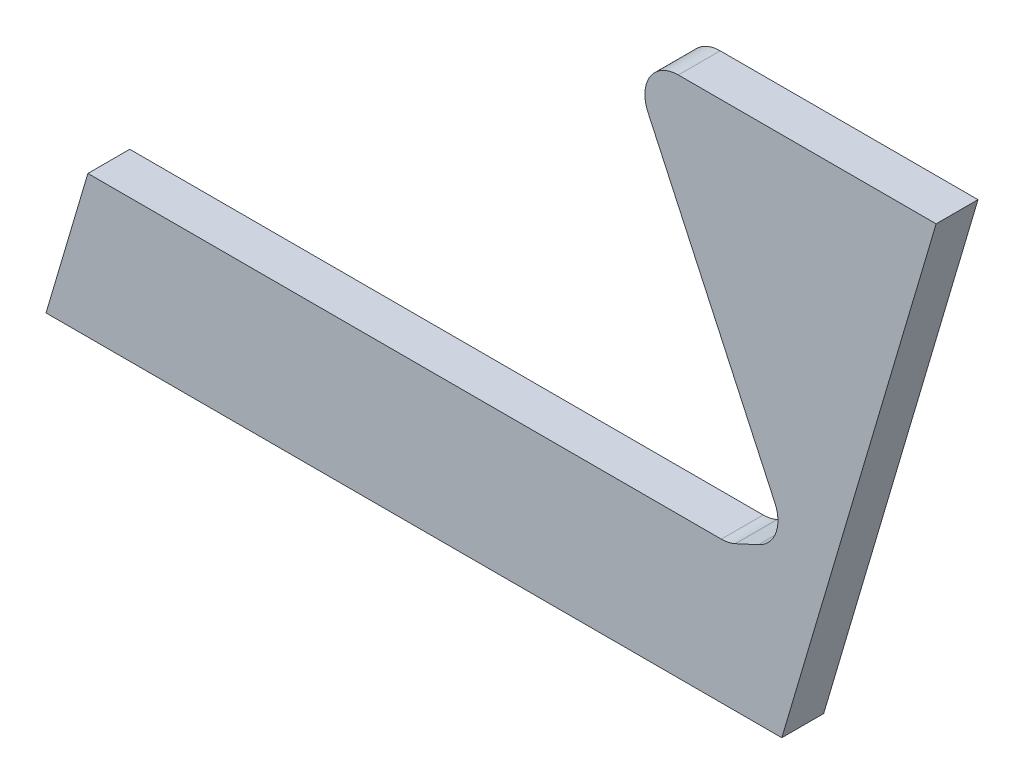
ISO-10303-21;
HEADER;
FILE_DESCRIPTION(('STEP AP214'),'2;1');
FILE_NAME('part.step','',(''),(''),'','','');
FILE_SCHEMA(('AUTOMOTIVE_DESIGN { 1 0 10303 214 1 1 1 1 }'));
ENDSEC;
DATA;
#1=APPLICATION_CONTEXT('core data for automotive mechanical design processes');
#2=APPLICATION_PROTOCOL_DEFINITION('international standard','automotive_design',2000,#1);
#3=PRODUCT_CONTEXT('',#1,'mechanical');
#4=PRODUCT('Part','Part','',(#3));
#5=PRODUCT_RELATED_PRODUCT_CATEGORY('part','',(#4));
#6=PRODUCT_DEFINITION_FORMATION('','',#4);
#7=PRODUCT_DEFINITION_CONTEXT('part definition',#1,'design');
#8=PRODUCT_DEFINITION('design','',#6,#7);
#9=PRODUCT_DEFINITION_SHAPE('','',#8);
#10=(LENGTH_UNIT() NAMED_UNIT(*) SI_UNIT(.MILLI.,.METRE.));
#11=(NAMED_UNIT(*) PLANE_ANGLE_UNIT() SI_UNIT($,.RADIAN.));
#12=(NAMED_UNIT(*) SI_UNIT($,.STERADIAN.) SOLID_ANGLE_UNIT());
#13=UNCERTAINTY_MEASURE_WITH_UNIT(LENGTH_MEASURE(1.E-05),#10,'distance_accuracy_value','');
#14=(GEOMETRIC_REPRESENTATION_CONTEXT(3) GLOBAL_UNCERTAINTY_ASSIGNED_CONTEXT((#13)) GLOBAL_UNIT_ASSIGNED_CONTEXT((#10,
#11,#12)) REPRESENTATION_CONTEXT('',''));
#15=CARTESIAN_POINT('',(0.,0.,0.));
#16=DIRECTION('',(0.,0.,1.));
#17=DIRECTION('',(1.,0.,0.));
#18=AXIS2_PLACEMENT_3D('',#15,#16,#17);
#19=CARTESIAN_POINT('',(-3.60928220138,-7.866246093769,0.));
#20=DIRECTION('',(0.,0.,1.));
#21=DIRECTION('',(-0.842412213008156,0.53883361381293,0.));
#22=AXIS2_PLACEMENT_3D('',#19,#20,#21);
#23=CYLINDRICAL_SURFACE('',#22,0.08);
#24=CARTESIAN_POINT('',(-3.60928220138,-7.866246093769,0.1));
#25=DIRECTION('',(0.,0.,-1.));
#26=DIRECTION('',(-0.842412213008156,0.53883361381293,0.));
#27=AXIS2_PLACEMENT_3D('',#24,#25,#26);
#28=CIRCLE('',#27,0.08);
#29=CARTESIAN_POINT('',(-3.681909404109,-7.899791427629,0.1));
#30=VERTEX_POINT('',#29);
#31=CARTESIAN_POINT('',(-3.60928220138,-7.786246093769,0.1));
#32=VERTEX_POINT('',#31);
#33=EDGE_CURVE('E11',#30,#32,#28,.T.);
#34=ORIENTED_EDGE('',*,*,#33,.T.);
#35=DIRECTION('',(0.,0.,-1.));
#36=VECTOR('',#35,1.);
#37=CARTESIAN_POINT('',(-3.60928220138,-7.786246093769,0.));
#38=LINE('',#37,#36);
#39=CARTESIAN_POINT('',(-3.60928220138,-7.786246093769,0.));
#40=VERTEX_POINT('',#39);
#41=EDGE_CURVE('E24',#32,#40,#38,.T.);
#42=ORIENTED_EDGE('',*,*,#41,.T.);
#43=CARTESIAN_POINT('',(-3.60928220138,-7.866246093769,0.));
#44=DIRECTION('',(0.,0.,1.));
#45=DIRECTION('',(-0.842412213008156,0.53883361381293,0.));
#46=AXIS2_PLACEMENT_3D('',#43,#44,#45);
#47=CIRCLE('',#46,0.08);
#48=CARTESIAN_POINT('',(-3.681909404109,-7.899791427629,0.));
#49=VERTEX_POINT('',#48);
#50=EDGE_CURVE('E174',#40,#49,#47,.T.);
#51=ORIENTED_EDGE('',*,*,#50,.T.);
#52=DIRECTION('',(0.,0.,1.));
#53=VECTOR('',#52,1.);
#54=CARTESIAN_POINT('',(-3.681909404109,-7.899791427629,0.));
#55=LINE('',#54,#53);
#56=EDGE_CURVE('E172',#49,#30,#55,.T.);
#57=ORIENTED_EDGE('',*,*,#56,.T.);
#58=EDGE_LOOP('',(#34,#42,#51,#57));
#59=FACE_BOUND('',#58,.T.);
#60=ADVANCED_FACE('F17',(#59),#23,.T.);
#61=CARTESIAN_POINT('',(-3.871660301846,-8.570365512901,0.));
#62=DIRECTION('',(0.,0.,1.));
#63=DIRECTION('',(1.,0.,0.));
#64=AXIS2_PLACEMENT_3D('',#61,#62,#63);
#65=PLANE('',#64);
#66=ORIENTED_EDGE('',*,*,#50,.F.);
#67=DIRECTION('',(-1.,0.,0.));
#68=VECTOR('',#67,1.);
#69=CARTESIAN_POINT('',(-2.993179354702,-7.786246093769,0.));
#70=LINE('',#69,#68);
#71=CARTESIAN_POINT('',(-2.993179354702,-7.786246093769,0.));
#72=VERTEX_POINT('',#71);
#73=EDGE_CURVE('E169',#72,#40,#70,.T.);
#74=ORIENTED_EDGE('',*,*,#73,.F.);
#75=DIRECTION('',(0.283427278082511,0.958993732012227,0.));
#76=VECTOR('',#75,1.);
#77=CARTESIAN_POINT('',(-3.362050690509,-9.034345081811,0.));
#78=LINE('',#77,#76);
#79=CARTESIAN_POINT('',(-3.362050690509,-9.034345081811,0.));
#80=VERTEX_POINT('',#79);
#81=EDGE_CURVE('E167',#80,#72,#78,.T.);
#82=ORIENTED_EDGE('',*,*,#81,.F.);
#83=DIRECTION('',(1.,0.,0.));
#84=VECTOR('',#83,1.);
#85=CARTESIAN_POINT('',(-5.120487403963,-9.034345081811,0.));
#86=LINE('',#85,#84);
#87=CARTESIAN_POINT('',(-5.120487403963,-9.034345081811,0.));
#88=VERTEX_POINT('',#87);
#89=EDGE_CURVE('E107',#88,#80,#86,.T.);
#90=ORIENTED_EDGE('',*,*,#89,.F.);
#91=DIRECTION('',(-0.2834272780825,-0.95899373201223,0.));
#92=VECTOR('',#91,1.);
#93=CARTESIAN_POINT('',(-5.020357010419,-8.695547699845,0.));
#94=LINE('',#93,#92);
#95=CARTESIAN_POINT('',(-5.020357010419,-8.695547699845,0.));
#96=VERTEX_POINT('',#95);
#97=EDGE_CURVE('E163',#96,#88,#94,.T.);
#98=ORIENTED_EDGE('',*,*,#97,.F.);
#99=DIRECTION('',(-1.,0.,0.));
#100=VECTOR('',#99,1.);
#101=CARTESIAN_POINT('',(-3.48897672076,-8.695547699845,0.));
#102=LINE('',#101,#100);
#103=CARTESIAN_POINT('',(-3.506559606777,-8.695547699845,0.));
#104=VERTEX_POINT('',#103);
#105=EDGE_CURVE('E160',#104,#96,#102,.T.);
#106=ORIENTED_EDGE('',*,*,#105,.F.);
#107=CARTESIAN_POINT('',(-3.506559606777,-8.615547699845,0.));
#108=DIRECTION('',(0.,0.,-1.));
#109=DIRECTION('',(0.214662486114038,-0.976688290630814,0.));
#110=AXIS2_PLACEMENT_3D('',#107,#108,#109);
#111=CIRCLE('',#110,0.08);
#112=CARTESIAN_POINT('',(-3.473014272917,-8.688174902573,0.));
#113=VERTEX_POINT('',#112);
#114=EDGE_CURVE('E157',#113,#104,#111,.T.);
#115=ORIENTED_EDGE('',*,*,#114,.F.);
#116=DIRECTION('',(-0.907840034110675,-0.419316673250574,0.));
#117=VECTOR('',#116,1.);
#118=CARTESIAN_POINT('',(-3.345064230922,-8.629076841312,0.));
#119=LINE('',#118,#117);
#120=CARTESIAN_POINT('',(-3.417691433651,-8.662622175172,0.));
#121=VERTEX_POINT('',#120);
#122=EDGE_CURVE('E154',#121,#113,#119,.T.);
#123=ORIENTED_EDGE('',*,*,#122,.F.);
#124=CARTESIAN_POINT('',(-3.451236767511,-8.589994972443,0.));
#125=DIRECTION('',(0.,0.,-1.));
#126=DIRECTION('',(0.938441507472354,-0.345438181232209,0.));
#127=AXIS2_PLACEMENT_3D('',#124,#125,#126);
#128=CIRCLE('',#127,0.08);
#129=CARTESIAN_POINT('',(-3.378609564782,-8.556449638583,0.));
#130=VERTEX_POINT('',#129);
#131=EDGE_CURVE('E151',#130,#121,#128,.T.);
#132=ORIENTED_EDGE('',*,*,#131,.F.);
#133=DIRECTION('',(0.419316673250582,-0.907840034110671,0.));
#134=VECTOR('',#133,1.);
#135=CARTESIAN_POINT('',(-3.734354162952,-7.786246093769,0.));
#136=LINE('',#135,#134);
#137=EDGE_CURVE('E148',#49,#130,#136,.T.);
#138=ORIENTED_EDGE('',*,*,#137,.F.);
#139=EDGE_LOOP('',(#66,#74,#82,#90,#98,#106,#115,#123,#132,#138));
#140=FACE_BOUND('',#139,.T.);
#141=ADVANCED_FACE('F180',(#140),#65,.F.);
#142=CARTESIAN_POINT('',(-2.993179354702,-7.786246093769,0.));
#143=DIRECTION('',(0.,1.,0.));
#144=DIRECTION('',(-1.,0.,0.));
#145=AXIS2_PLACEMENT_3D('',#142,#143,#144);
#146=PLANE('',#145);
#147=ORIENTED_EDGE('',*,*,#41,.F.);
#148=DIRECTION('',(-1.,0.,0.));
#149=VECTOR('',#148,1.);
#150=CARTESIAN_POINT('',(-2.993179354702,-7.786246093769,0.1));
#151=LINE('',#150,#149);
#152=CARTESIAN_POINT('',(-2.993179354702,-7.786246093769,0.1));
#153=VERTEX_POINT('',#152);
#154=EDGE_CURVE('E146',#153,#32,#151,.T.);
#155=ORIENTED_EDGE('',*,*,#154,.F.);
#156=DIRECTION('',(0.,0.,1.));
#157=VECTOR('',#156,1.);
#158=CARTESIAN_POINT('',(-2.993179354702,-7.786246093769,0.));
#159=LINE('',#158,#157);
#160=EDGE_CURVE('E97',#72,#153,#159,.T.);
#161=ORIENTED_EDGE('',*,*,#160,.F.);
#162=ORIENTED_EDGE('',*,*,#73,.T.);
#163=EDGE_LOOP('',(#147,#155,#161,#162));
#164=FACE_BOUND('',#163,.T.);
#165=ADVANCED_FACE('F181',(#164),#146,.T.);
#166=CARTESIAN_POINT('',(-3.506559606777,-8.615547699845,0.));
#167=DIRECTION('',(0.,0.,1.));
#168=DIRECTION('',(0.214662486114038,-0.976688290630814,0.));
#169=AXIS2_PLACEMENT_3D('',#166,#167,#168);
#170=CYLINDRICAL_SURFACE('',#169,0.08);
#171=ORIENTED_EDGE('',*,*,#114,.T.);
#172=DIRECTION('',(0.,0.,1.));
#173=VECTOR('',#172,1.);
#174=CARTESIAN_POINT('',(-3.506559606777,-8.695547699845,0.));
#175=LINE('',#174,#173);
#176=CARTESIAN_POINT('',(-3.506559606777,-8.695547699845,0.1));
#177=VERTEX_POINT('',#176);
#178=EDGE_CURVE('E142',#104,#177,#175,.T.);
#179=ORIENTED_EDGE('',*,*,#178,.T.);
#180=CARTESIAN_POINT('',(-3.506559606777,-8.615547699845,0.1));
#181=DIRECTION('',(0.,0.,1.));
#182=DIRECTION('',(0.214662486114038,-0.976688290630814,0.));
#183=AXIS2_PLACEMENT_3D('',#180,#181,#182);
#184=CIRCLE('',#183,0.08);
#185=CARTESIAN_POINT('',(-3.473014272917,-8.688174902573,0.1));
#186=VERTEX_POINT('',#185);
#187=EDGE_CURVE('E139',#177,#186,#184,.T.);
#188=ORIENTED_EDGE('',*,*,#187,.T.);
#189=DIRECTION('',(0.,0.,-1.));
#190=VECTOR('',#189,1.);
#191=CARTESIAN_POINT('',(-3.473014272917,-8.688174902573,0.));
#192=LINE('',#191,#190);
#193=EDGE_CURVE('E136',#186,#113,#192,.T.);
#194=ORIENTED_EDGE('',*,*,#193,.T.);
#195=EDGE_LOOP('',(#171,#179,#188,#194));
#196=FACE_BOUND('',#195,.T.);
#197=ADVANCED_FACE('F183',(#196),#170,.F.);
#198=CARTESIAN_POINT('',(-3.48897672076,-8.695547699845,0.));
#199=DIRECTION('',(0.,1.,0.));
#200=DIRECTION('',(-1.,0.,0.));
#201=AXIS2_PLACEMENT_3D('',#198,#199,#200);
#202=PLANE('',#201);
#203=ORIENTED_EDGE('',*,*,#178,.F.);
#204=ORIENTED_EDGE('',*,*,#105,.T.);
#205=DIRECTION('',(0.,0.,1.));
#206=VECTOR('',#205,1.);
#207=CARTESIAN_POINT('',(-5.020357010419,-8.695547699845,0.));
#208=LINE('',#207,#206);
#209=CARTESIAN_POINT('',(-5.020357010419,-8.695547699845,0.1));
#210=VERTEX_POINT('',#209);
#211=EDGE_CURVE('E134',#96,#210,#208,.T.);
#212=ORIENTED_EDGE('',*,*,#211,.T.);
#213=DIRECTION('',(-1.,0.,0.));
#214=VECTOR('',#213,1.);
#215=CARTESIAN_POINT('',(-3.48897672076,-8.695547699845,0.1));
#216=LINE('',#215,#214);
#217=EDGE_CURVE('E132',#177,#210,#216,.T.);
#218=ORIENTED_EDGE('',*,*,#217,.F.);
#219=EDGE_LOOP('',(#203,#204,#212,#218));
#220=FACE_BOUND('',#219,.T.);
#221=ADVANCED_FACE('F190',(#220),#202,.T.);
#222=CARTESIAN_POINT('',(-3.451236767511,-8.589994972443,0.));
#223=DIRECTION('',(0.,0.,1.));
#224=DIRECTION('',(0.938441507472354,-0.345438181232209,0.));
#225=AXIS2_PLACEMENT_3D('',#222,#223,#224);
#226=CYLINDRICAL_SURFACE('',#225,0.08);
#227=ORIENTED_EDGE('',*,*,#131,.T.);
#228=DIRECTION('',(0.,0.,1.));
#229=VECTOR('',#228,1.);
#230=CARTESIAN_POINT('',(-3.417691433651,-8.662622175172,0.));
#231=LINE('',#230,#229);
#232=CARTESIAN_POINT('',(-3.417691433651,-8.662622175172,0.1));
#233=VERTEX_POINT('',#232);
#234=EDGE_CURVE('E129',#121,#233,#231,.T.);
#235=ORIENTED_EDGE('',*,*,#234,.T.);
#236=CARTESIAN_POINT('',(-3.451236767511,-8.589994972443,0.1));
#237=DIRECTION('',(0.,0.,1.));
#238=DIRECTION('',(0.938441507472354,-0.345438181232209,0.));
#239=AXIS2_PLACEMENT_3D('',#236,#237,#238);
#240=CIRCLE('',#239,0.08);
#241=CARTESIAN_POINT('',(-3.378609564782,-8.556449638583,0.1));
#242=VERTEX_POINT('',#241);
#243=EDGE_CURVE('E126',#233,#242,#240,.T.);
#244=ORIENTED_EDGE('',*,*,#243,.T.);
#245=DIRECTION('',(0.,0.,-1.));
#246=VECTOR('',#245,1.);
#247=CARTESIAN_POINT('',(-3.378609564782,-8.556449638583,0.));
#248=LINE('',#247,#246);
#249=EDGE_CURVE('E123',#242,#130,#248,.T.);
#250=ORIENTED_EDGE('',*,*,#249,.T.);
#251=EDGE_LOOP('',(#227,#235,#244,#250));
#252=FACE_BOUND('',#251,.T.);
#253=ADVANCED_FACE('F227',(#252),#226,.F.);
#254=CARTESIAN_POINT('',(-3.345064230922,-8.629076841312,0.));
#255=DIRECTION('',(-0.419316673250574,0.907840034110675,0.));
#256=DIRECTION('',(-0.907840034110675,-0.419316673250574,0.));
#257=AXIS2_PLACEMENT_3D('',#254,#255,#256);
#258=PLANE('',#257);
#259=ORIENTED_EDGE('',*,*,#193,.F.);
#260=DIRECTION('',(-0.907840034110675,-0.419316673250574,0.));
#261=VECTOR('',#260,1.);
#262=CARTESIAN_POINT('',(-3.345064230922,-8.629076841312,0.1));
#263=LINE('',#262,#261);
#264=EDGE_CURVE('E120',#233,#186,#263,.T.);
#265=ORIENTED_EDGE('',*,*,#264,.F.);
#266=ORIENTED_EDGE('',*,*,#234,.F.);
#267=ORIENTED_EDGE('',*,*,#122,.T.);
#268=EDGE_LOOP('',(#259,#265,#266,#267));
#269=FACE_BOUND('',#268,.T.);
#270=ADVANCED_FACE('F237',(#269),#258,.T.);
#271=CARTESIAN_POINT('',(-5.020357010419,-8.695547699845,0.));
#272=DIRECTION('',(-0.95899373201223,0.2834272780825,0.));
#273=DIRECTION('',(-0.2834272780825,-0.95899373201223,0.));
#274=AXIS2_PLACEMENT_3D('',#271,#272,#273);
#275=PLANE('',#274);
#276=ORIENTED_EDGE('',*,*,#97,.T.);
#277=DIRECTION('',(0.,0.,1.));
#278=VECTOR('',#277,1.);
#279=CARTESIAN_POINT('',(-5.120487403963,-9.034345081811,0.));
#280=LINE('',#279,#278);
#281=CARTESIAN_POINT('',(-5.120487403963,-9.034345081811,0.1));
#282=VERTEX_POINT('',#281);
#283=EDGE_CURVE('E118',#88,#282,#280,.T.);
#284=ORIENTED_EDGE('',*,*,#283,.T.);
#285=DIRECTION('',(-0.2834272780825,-0.95899373201223,0.));
#286=VECTOR('',#285,1.);
#287=CARTESIAN_POINT('',(-5.020357010419,-8.695547699845,0.1));
#288=LINE('',#287,#286);
#289=EDGE_CURVE('E113',#210,#282,#288,.T.);
#290=ORIENTED_EDGE('',*,*,#289,.F.);
#291=ORIENTED_EDGE('',*,*,#211,.F.);
#292=EDGE_LOOP('',(#276,#284,#290,#291));
#293=FACE_BOUND('',#292,.T.);
#294=ADVANCED_FACE('F247',(#293),#275,.T.);
#295=CARTESIAN_POINT('',(-3.734354162952,-7.786246093769,0.));
#296=DIRECTION('',(-0.907840034110671,-0.419316673250582,0.));
#297=DIRECTION('',(0.419316673250582,-0.907840034110671,0.));
#298=AXIS2_PLACEMENT_3D('',#295,#296,#297);
#299=PLANE('',#298);
#300=ORIENTED_EDGE('',*,*,#56,.F.);
#301=ORIENTED_EDGE('',*,*,#137,.T.);
#302=ORIENTED_EDGE('',*,*,#249,.F.);
#303=DIRECTION('',(0.419316673250582,-0.907840034110671,0.));
#304=VECTOR('',#303,1.);
#305=CARTESIAN_POINT('',(-3.734354162952,-7.786246093769,0.1));
#306=LINE('',#305,#304);
#307=EDGE_CURVE('E99',#30,#242,#306,.T.);
#308=ORIENTED_EDGE('',*,*,#307,.F.);
#309=EDGE_LOOP('',(#300,#301,#302,#308));
#310=FACE_BOUND('',#309,.T.);
#311=ADVANCED_FACE('F257',(#310),#299,.T.);
#312=CARTESIAN_POINT('',(-3.362050690509,-9.034345081811,0.));
#313=DIRECTION('',(0.958993732012227,-0.283427278082511,0.));
#314=DIRECTION('',(0.283427278082511,0.958993732012227,0.));
#315=AXIS2_PLACEMENT_3D('',#312,#313,#314);
#316=PLANE('',#315);
#317=ORIENTED_EDGE('',*,*,#81,.T.);
#318=ORIENTED_EDGE('',*,*,#160,.T.);
#319=DIRECTION('',(0.283427278082511,0.958993732012227,0.));
#320=VECTOR('',#319,1.);
#321=CARTESIAN_POINT('',(-3.362050690509,-9.034345081811,0.1));
#322=LINE('',#321,#320);
#323=CARTESIAN_POINT('',(-3.362050690509,-9.034345081811,0.1));
#324=VERTEX_POINT('',#323);
#325=EDGE_CURVE('E91',#324,#153,#322,.T.);
#326=ORIENTED_EDGE('',*,*,#325,.F.);
#327=DIRECTION('',(0.,0.,1.));
#328=VECTOR('',#327,1.);
#329=CARTESIAN_POINT('',(-3.362050690509,-9.034345081811,0.));
#330=LINE('',#329,#328);
#331=EDGE_CURVE('E95',#80,#324,#330,.T.);
#332=ORIENTED_EDGE('',*,*,#331,.F.);
#333=EDGE_LOOP('',(#317,#318,#326,#332));
#334=FACE_BOUND('',#333,.T.);
#335=ADVANCED_FACE('F94',(#334),#316,.T.);
#336=CARTESIAN_POINT('',(-5.120487403963,-9.034345081811,0.));
#337=DIRECTION('',(0.,-1.,0.));
#338=DIRECTION('',(1.,0.,0.));
#339=AXIS2_PLACEMENT_3D('',#336,#337,#338);
#340=PLANE('',#339);
#341=ORIENTED_EDGE('',*,*,#89,.T.);
#342=ORIENTED_EDGE('',*,*,#331,.T.);
#343=DIRECTION('',(1.,0.,0.));
#344=VECTOR('',#343,1.);
#345=CARTESIAN_POINT('',(-5.120487403963,-9.034345081811,0.1));
#346=LINE('',#345,#344);
#347=EDGE_CURVE('E106',#282,#324,#346,.T.);
#348=ORIENTED_EDGE('',*,*,#347,.F.);
#349=ORIENTED_EDGE('',*,*,#283,.F.);
#350=EDGE_LOOP('',(#341,#342,#348,#349));
#351=FACE_BOUND('',#350,.T.);
#352=ADVANCED_FACE('F104',(#351),#340,.T.);
#353=CARTESIAN_POINT('',(-3.871660301846,-8.570365512901,0.1));
#354=DIRECTION('',(0.,0.,1.));
#355=DIRECTION('',(1.,0.,0.));
#356=AXIS2_PLACEMENT_3D('',#353,#354,#355);
#357=PLANE('',#356);
#358=ORIENTED_EDGE('',*,*,#33,.F.);
#359=ORIENTED_EDGE('',*,*,#307,.T.);
#360=ORIENTED_EDGE('',*,*,#243,.F.);
#361=ORIENTED_EDGE('',*,*,#264,.T.);
#362=ORIENTED_EDGE('',*,*,#187,.F.);
#363=ORIENTED_EDGE('',*,*,#217,.T.);
#364=ORIENTED_EDGE('',*,*,#289,.T.);
#365=ORIENTED_EDGE('',*,*,#347,.T.);
#366=ORIENTED_EDGE('',*,*,#325,.T.);
#367=ORIENTED_EDGE('',*,*,#154,.T.);
#368=EDGE_LOOP('',(#358,#359,#360,#361,#362,#363,#364,#365,#366,#367));
#369=FACE_BOUND('',#368,.T.);
#370=ADVANCED_FACE('F110',(#369),#357,.T.);
#371=CLOSED_SHELL('',(#60,#141,#165,#197,#221,#253,#270,#294,#311,#335,#352,#370));
#372=MANIFOLD_SOLID_BREP('B1',#371);
#373=ADVANCED_BREP_SHAPE_REPRESENTATION('',(#18,#372),#14);
#374=SHAPE_DEFINITION_REPRESENTATION(#9,#373);
ENDSEC;
END-ISO-10303-21;
